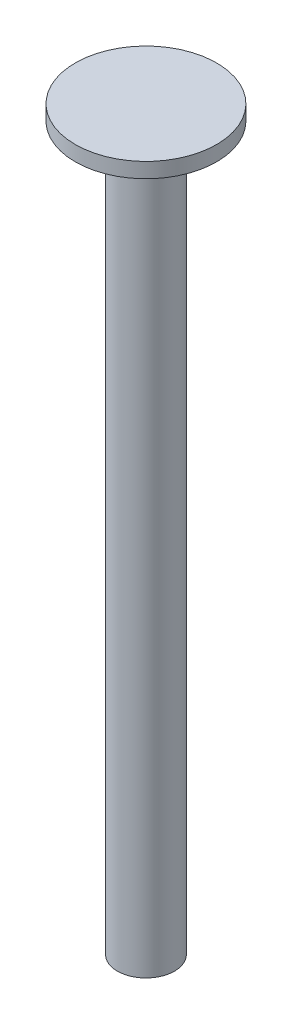
ISO-10303-21;
HEADER;
FILE_DESCRIPTION(('STEP AP214'),'2;1');
FILE_NAME('part.step','',(''),(''),'','','');
FILE_SCHEMA(('AUTOMOTIVE_DESIGN { 1 0 10303 214 1 1 1 1 }'));
ENDSEC;
DATA;
#1=APPLICATION_CONTEXT('core data for automotive mechanical design processes');
#2=APPLICATION_PROTOCOL_DEFINITION('international standard','automotive_design',2000,#1);
#3=PRODUCT_CONTEXT('',#1,'mechanical');
#4=PRODUCT('Part','Part','',(#3));
#5=PRODUCT_RELATED_PRODUCT_CATEGORY('part','',(#4));
#6=PRODUCT_DEFINITION_FORMATION('','',#4);
#7=PRODUCT_DEFINITION_CONTEXT('part definition',#1,'design');
#8=PRODUCT_DEFINITION('design','',#6,#7);
#9=PRODUCT_DEFINITION_SHAPE('','',#8);
#10=(LENGTH_UNIT() NAMED_UNIT(*) SI_UNIT(.MILLI.,.METRE.));
#11=(NAMED_UNIT(*) PLANE_ANGLE_UNIT() SI_UNIT($,.RADIAN.));
#12=(NAMED_UNIT(*) SI_UNIT($,.STERADIAN.) SOLID_ANGLE_UNIT());
#13=UNCERTAINTY_MEASURE_WITH_UNIT(LENGTH_MEASURE(1.E-05),#10,'distance_accuracy_value','');
#14=(GEOMETRIC_REPRESENTATION_CONTEXT(3) GLOBAL_UNCERTAINTY_ASSIGNED_CONTEXT((#13)) GLOBAL_UNIT_ASSIGNED_CONTEXT((#10,
#11,#12)) REPRESENTATION_CONTEXT('',''));
#15=CARTESIAN_POINT('',(0.,0.,0.));
#16=DIRECTION('',(0.,0.,1.));
#17=DIRECTION('',(1.,0.,0.));
#18=AXIS2_PLACEMENT_3D('',#15,#16,#17);
#19=CARTESIAN_POINT('',(0.,24.,0.));
#20=DIRECTION('',(0.,-1.,0.));
#21=DIRECTION('',(0.,0.,-1.));
#22=AXIS2_PLACEMENT_3D('',#19,#20,#21);
#23=CYLINDRICAL_SURFACE('',#22,0.95);
#24=CARTESIAN_POINT('',(0.,24.,0.));
#25=DIRECTION('',(0.,1.,0.));
#26=DIRECTION('',(0.,0.,1.));
#27=AXIS2_PLACEMENT_3D('',#24,#25,#26);
#28=CIRCLE('',#27,0.95);
#29=CARTESIAN_POINT('',(0.,24.,0.95));
#30=VERTEX_POINT('',#29);
#31=EDGE_CURVE('E10',#30,#30,#28,.T.);
#32=ORIENTED_EDGE('',*,*,#31,.F.);
#33=EDGE_LOOP('',(#32));
#34=FACE_BOUND('',#33,.T.);
#35=CARTESIAN_POINT('',(0.,0.,0.));
#36=DIRECTION('',(0.,1.,0.));
#37=DIRECTION('',(0.,0.,1.));
#38=AXIS2_PLACEMENT_3D('',#35,#36,#37);
#39=CIRCLE('',#38,0.95);
#40=CARTESIAN_POINT('',(0.,0.,0.95));
#41=VERTEX_POINT('',#40);
#42=EDGE_CURVE('E34',#41,#41,#39,.T.);
#43=ORIENTED_EDGE('',*,*,#42,.T.);
#44=EDGE_LOOP('',(#43));
#45=FACE_BOUND('',#44,.T.);
#46=ADVANCED_FACE('F31',(#34,#45),#23,.T.);
#47=CARTESIAN_POINT('',(0.,0.,0.));
#48=DIRECTION('',(0.,1.,0.));
#49=DIRECTION('',(0.,0.,1.));
#50=AXIS2_PLACEMENT_3D('',#47,#48,#49);
#51=PLANE('',#50);
#52=ORIENTED_EDGE('',*,*,#42,.F.);
#53=EDGE_LOOP('',(#52));
#54=FACE_BOUND('',#53,.T.);
#55=ADVANCED_FACE('F54',(#54),#51,.F.);
#56=CARTESIAN_POINT('',(0.,24.5,0.));
#57=DIRECTION('',(0.,-1.,0.));
#58=DIRECTION('',(0.,0.,-1.));
#59=AXIS2_PLACEMENT_3D('',#56,#57,#58);
#60=CYLINDRICAL_SURFACE('',#59,2.35);
#61=CARTESIAN_POINT('',(0.,24.5,0.));
#62=DIRECTION('',(0.,1.,0.));
#63=DIRECTION('',(0.,0.,1.));
#64=AXIS2_PLACEMENT_3D('',#61,#62,#63);
#65=CIRCLE('',#64,2.35);
#66=CARTESIAN_POINT('',(0.,24.5,2.35));
#67=VERTEX_POINT('',#66);
#68=EDGE_CURVE('E41',#67,#67,#65,.T.);
#69=ORIENTED_EDGE('',*,*,#68,.F.);
#70=EDGE_LOOP('',(#69));
#71=FACE_BOUND('',#70,.T.);
#72=CARTESIAN_POINT('',(0.,24.,0.));
#73=DIRECTION('',(0.,1.,0.));
#74=DIRECTION('',(0.,0.,1.));
#75=AXIS2_PLACEMENT_3D('',#72,#73,#74);
#76=CIRCLE('',#75,2.35);
#77=CARTESIAN_POINT('',(0.,24.,2.35));
#78=VERTEX_POINT('',#77);
#79=EDGE_CURVE('E43',#78,#78,#76,.T.);
#80=ORIENTED_EDGE('',*,*,#79,.T.);
#81=EDGE_LOOP('',(#80));
#82=FACE_BOUND('',#81,.T.);
#83=ADVANCED_FACE('F51',(#71,#82),#60,.T.);
#84=CARTESIAN_POINT('',(0.,24.5,0.));
#85=DIRECTION('',(0.,1.,0.));
#86=DIRECTION('',(0.,0.,1.));
#87=AXIS2_PLACEMENT_3D('',#84,#85,#86);
#88=PLANE('',#87);
#89=ORIENTED_EDGE('',*,*,#68,.T.);
#90=EDGE_LOOP('',(#89));
#91=FACE_BOUND('',#90,.T.);
#92=ADVANCED_FACE('F49',(#91),#88,.T.);
#93=CARTESIAN_POINT('',(0.,24.,0.));
#94=DIRECTION('',(0.,1.,0.));
#95=DIRECTION('',(0.,0.,1.));
#96=AXIS2_PLACEMENT_3D('',#93,#94,#95);
#97=PLANE('',#96);
#98=ORIENTED_EDGE('',*,*,#31,.T.);
#99=EDGE_LOOP('',(#98));
#100=FACE_BOUND('',#99,.T.);
#101=ORIENTED_EDGE('',*,*,#79,.F.);
#102=EDGE_LOOP('',(#101));
#103=FACE_BOUND('',#102,.T.);
#104=ADVANCED_FACE('F58',(#100,#103),#97,.F.);
#105=CLOSED_SHELL('',(#46,#55,#83,#92,#104));
#106=MANIFOLD_SOLID_BREP('B2',#105);
#107=ADVANCED_BREP_SHAPE_REPRESENTATION('',(#18,#106),#14);
#108=SHAPE_DEFINITION_REPRESENTATION(#9,#107);
ENDSEC;
END-ISO-10303-21;
